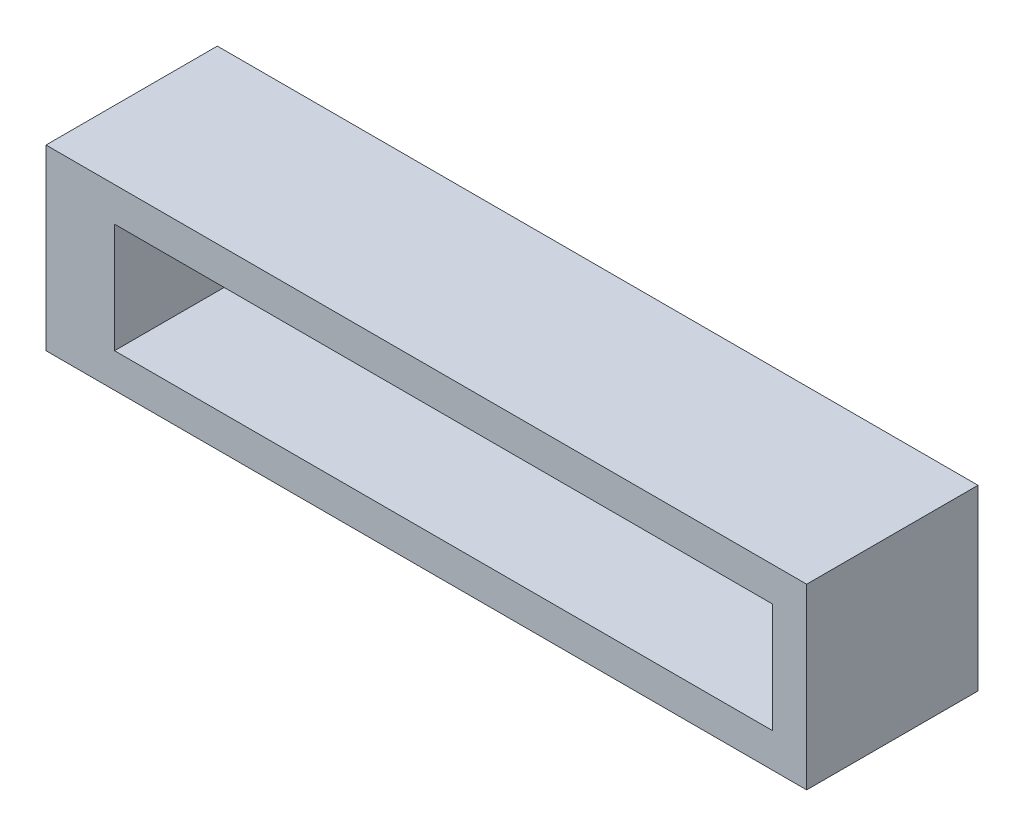
ISO-10303-21;
HEADER;
FILE_DESCRIPTION(('STEP AP214'),'2;1');
FILE_NAME('part.step','',(''),(''),'','','');
FILE_SCHEMA(('AUTOMOTIVE_DESIGN { 1 0 10303 214 1 1 1 1 }'));
ENDSEC;
DATA;
#1=APPLICATION_CONTEXT('core data for automotive mechanical design processes');
#2=APPLICATION_PROTOCOL_DEFINITION('international standard','automotive_design',2000,#1);
#3=PRODUCT_CONTEXT('',#1,'mechanical');
#4=PRODUCT('Part','Part','',(#3));
#5=PRODUCT_RELATED_PRODUCT_CATEGORY('part','',(#4));
#6=PRODUCT_DEFINITION_FORMATION('','',#4);
#7=PRODUCT_DEFINITION_CONTEXT('part definition',#1,'design');
#8=PRODUCT_DEFINITION('design','',#6,#7);
#9=PRODUCT_DEFINITION_SHAPE('','',#8);
#10=(LENGTH_UNIT() NAMED_UNIT(*) SI_UNIT(.MILLI.,.METRE.));
#11=(NAMED_UNIT(*) PLANE_ANGLE_UNIT() SI_UNIT($,.RADIAN.));
#12=(NAMED_UNIT(*) SI_UNIT($,.STERADIAN.) SOLID_ANGLE_UNIT());
#13=UNCERTAINTY_MEASURE_WITH_UNIT(LENGTH_MEASURE(1.E-05),#10,'distance_accuracy_value','');
#14=(GEOMETRIC_REPRESENTATION_CONTEXT(3) GLOBAL_UNCERTAINTY_ASSIGNED_CONTEXT((#13)) GLOBAL_UNIT_ASSIGNED_CONTEXT((#10,
#11,#12)) REPRESENTATION_CONTEXT('',''));
#15=CARTESIAN_POINT('',(0.,0.,0.));
#16=DIRECTION('',(0.,0.,1.));
#17=DIRECTION('',(1.,0.,0.));
#18=AXIS2_PLACEMENT_3D('',#15,#16,#17);
#19=CARTESIAN_POINT('',(0.,0.,5.));
#20=DIRECTION('',(0.,0.,-1.));
#21=DIRECTION('',(-1.,0.,0.));
#22=AXIS2_PLACEMENT_3D('',#19,#20,#21);
#23=PLANE('',#22);
#24=DIRECTION('',(0.,-1.,0.));
#25=VECTOR('',#24,1.);
#26=CARTESIAN_POINT('',(0.,0.,5.));
#27=LINE('',#26,#25);
#28=CARTESIAN_POINT('',(0.,5.2,5.));
#29=VERTEX_POINT('',#28);
#30=CARTESIAN_POINT('',(0.,0.,5.));
#31=VERTEX_POINT('',#30);
#32=EDGE_CURVE('E134',#29,#31,#27,.T.);
#33=ORIENTED_EDGE('',*,*,#32,.T.);
#34=DIRECTION('',(1.,0.,0.));
#35=VECTOR('',#34,1.);
#36=CARTESIAN_POINT('',(0.,0.,5.));
#37=LINE('',#36,#35);
#38=CARTESIAN_POINT('',(22.2,0.,5.));
#39=VERTEX_POINT('',#38);
#40=EDGE_CURVE('E137',#31,#39,#37,.T.);
#41=ORIENTED_EDGE('',*,*,#40,.T.);
#42=DIRECTION('',(0.,1.,0.));
#43=VECTOR('',#42,1.);
#44=CARTESIAN_POINT('',(22.2,0.,5.));
#45=LINE('',#44,#43);
#46=CARTESIAN_POINT('',(22.2,5.2,5.));
#47=VERTEX_POINT('',#46);
#48=EDGE_CURVE('E140',#39,#47,#45,.T.);
#49=ORIENTED_EDGE('',*,*,#48,.T.);
#50=DIRECTION('',(-1.,0.,0.));
#51=VECTOR('',#50,1.);
#52=CARTESIAN_POINT('',(0.,5.2,5.));
#53=LINE('',#52,#51);
#54=EDGE_CURVE('E142',#47,#29,#53,.T.);
#55=ORIENTED_EDGE('',*,*,#54,.T.);
#56=EDGE_LOOP('',(#33,#41,#49,#55));
#57=FACE_BOUND('',#56,.T.);
#58=DIRECTION('',(0.,-1.,0.));
#59=VECTOR('',#58,1.);
#60=CARTESIAN_POINT('',(2.,1.,5.));
#61=LINE('',#60,#59);
#62=CARTESIAN_POINT('',(2.,4.2,5.));
#63=VERTEX_POINT('',#62);
#64=CARTESIAN_POINT('',(2.,1.,5.));
#65=VERTEX_POINT('',#64);
#66=EDGE_CURVE('E98',#63,#65,#61,.T.);
#67=ORIENTED_EDGE('',*,*,#66,.F.);
#68=DIRECTION('',(-1.,0.,0.));
#69=VECTOR('',#68,1.);
#70=CARTESIAN_POINT('',(2.,4.2,5.));
#71=LINE('',#70,#69);
#72=CARTESIAN_POINT('',(21.2,4.2,5.));
#73=VERTEX_POINT('',#72);
#74=EDGE_CURVE('E120',#73,#63,#71,.T.);
#75=ORIENTED_EDGE('',*,*,#74,.F.);
#76=DIRECTION('',(0.,1.,0.));
#77=VECTOR('',#76,1.);
#78=CARTESIAN_POINT('',(21.2,1.,5.));
#79=LINE('',#78,#77);
#80=CARTESIAN_POINT('',(21.2,1.,5.));
#81=VERTEX_POINT('',#80);
#82=EDGE_CURVE('E118',#81,#73,#79,.T.);
#83=ORIENTED_EDGE('',*,*,#82,.F.);
#84=DIRECTION('',(1.,0.,0.));
#85=VECTOR('',#84,1.);
#86=CARTESIAN_POINT('',(2.,1.,5.));
#87=LINE('',#86,#85);
#88=EDGE_CURVE('E106',#65,#81,#87,.T.);
#89=ORIENTED_EDGE('',*,*,#88,.F.);
#90=EDGE_LOOP('',(#67,#75,#83,#89));
#91=FACE_BOUND('',#90,.T.);
#92=ADVANCED_FACE('F33',(#57,#91),#23,.F.);
#93=CARTESIAN_POINT('',(0.,0.,0.));
#94=DIRECTION('',(0.,0.,-1.));
#95=DIRECTION('',(-1.,0.,0.));
#96=AXIS2_PLACEMENT_3D('',#93,#94,#95);
#97=PLANE('',#96);
#98=DIRECTION('',(0.,-1.,0.));
#99=VECTOR('',#98,1.);
#100=CARTESIAN_POINT('',(0.,0.,0.));
#101=LINE('',#100,#99);
#102=CARTESIAN_POINT('',(0.,5.2,0.));
#103=VERTEX_POINT('',#102);
#104=CARTESIAN_POINT('',(0.,0.,0.));
#105=VERTEX_POINT('',#104);
#106=EDGE_CURVE('E114',#103,#105,#101,.T.);
#107=ORIENTED_EDGE('',*,*,#106,.F.);
#108=DIRECTION('',(-1.,0.,0.));
#109=VECTOR('',#108,1.);
#110=CARTESIAN_POINT('',(0.,5.2,0.));
#111=LINE('',#110,#109);
#112=CARTESIAN_POINT('',(22.2,5.2,0.));
#113=VERTEX_POINT('',#112);
#114=EDGE_CURVE('E138',#113,#103,#111,.T.);
#115=ORIENTED_EDGE('',*,*,#114,.F.);
#116=DIRECTION('',(0.,1.,0.));
#117=VECTOR('',#116,1.);
#118=CARTESIAN_POINT('',(22.2,0.,0.));
#119=LINE('',#118,#117);
#120=CARTESIAN_POINT('',(22.2,0.,0.));
#121=VERTEX_POINT('',#120);
#122=EDGE_CURVE('E149',#121,#113,#119,.T.);
#123=ORIENTED_EDGE('',*,*,#122,.F.);
#124=DIRECTION('',(1.,0.,0.));
#125=VECTOR('',#124,1.);
#126=CARTESIAN_POINT('',(0.,0.,0.));
#127=LINE('',#126,#125);
#128=EDGE_CURVE('E147',#105,#121,#127,.T.);
#129=ORIENTED_EDGE('',*,*,#128,.F.);
#130=EDGE_LOOP('',(#107,#115,#123,#129));
#131=FACE_BOUND('',#130,.T.);
#132=DIRECTION('',(-1.,0.,0.));
#133=VECTOR('',#132,1.);
#134=CARTESIAN_POINT('',(2.,4.2,0.));
#135=LINE('',#134,#133);
#136=CARTESIAN_POINT('',(21.2,4.2,0.));
#137=VERTEX_POINT('',#136);
#138=CARTESIAN_POINT('',(2.,4.2,0.));
#139=VERTEX_POINT('',#138);
#140=EDGE_CURVE('E107',#137,#139,#135,.T.);
#141=ORIENTED_EDGE('',*,*,#140,.T.);
#142=DIRECTION('',(0.,-1.,0.));
#143=VECTOR('',#142,1.);
#144=CARTESIAN_POINT('',(2.,1.,0.));
#145=LINE('',#144,#143);
#146=CARTESIAN_POINT('',(2.,1.,0.));
#147=VERTEX_POINT('',#146);
#148=EDGE_CURVE('E56',#139,#147,#145,.T.);
#149=ORIENTED_EDGE('',*,*,#148,.T.);
#150=DIRECTION('',(1.,0.,0.));
#151=VECTOR('',#150,1.);
#152=CARTESIAN_POINT('',(2.,1.,0.));
#153=LINE('',#152,#151);
#154=CARTESIAN_POINT('',(21.2,1.,0.));
#155=VERTEX_POINT('',#154);
#156=EDGE_CURVE('E113',#147,#155,#153,.T.);
#157=ORIENTED_EDGE('',*,*,#156,.T.);
#158=DIRECTION('',(0.,1.,0.));
#159=VECTOR('',#158,1.);
#160=CARTESIAN_POINT('',(21.2,1.,0.));
#161=LINE('',#160,#159);
#162=EDGE_CURVE('E126',#155,#137,#161,.T.);
#163=ORIENTED_EDGE('',*,*,#162,.T.);
#164=EDGE_LOOP('',(#141,#149,#157,#163));
#165=FACE_BOUND('',#164,.T.);
#166=ADVANCED_FACE('F167',(#131,#165),#97,.T.);
#167=CARTESIAN_POINT('',(0.,0.,5.));
#168=DIRECTION('',(1.,0.,0.));
#169=DIRECTION('',(0.,0.,-1.));
#170=AXIS2_PLACEMENT_3D('',#167,#168,#169);
#171=PLANE('',#170);
#172=ORIENTED_EDGE('',*,*,#106,.T.);
#173=DIRECTION('',(0.,0.,-1.));
#174=VECTOR('',#173,1.);
#175=CARTESIAN_POINT('',(0.,0.,5.));
#176=LINE('',#175,#174);
#177=EDGE_CURVE('E11',#31,#105,#176,.T.);
#178=ORIENTED_EDGE('',*,*,#177,.F.);
#179=ORIENTED_EDGE('',*,*,#32,.F.);
#180=DIRECTION('',(0.,0.,-1.));
#181=VECTOR('',#180,1.);
#182=CARTESIAN_POINT('',(0.,5.2,5.));
#183=LINE('',#182,#181);
#184=EDGE_CURVE('E144',#29,#103,#183,.T.);
#185=ORIENTED_EDGE('',*,*,#184,.T.);
#186=EDGE_LOOP('',(#172,#178,#179,#185));
#187=FACE_BOUND('',#186,.T.);
#188=ADVANCED_FACE('F35',(#187),#171,.F.);
#189=CARTESIAN_POINT('',(0.,0.,5.));
#190=DIRECTION('',(0.,1.,0.));
#191=DIRECTION('',(0.,0.,1.));
#192=AXIS2_PLACEMENT_3D('',#189,#190,#191);
#193=PLANE('',#192);
#194=ORIENTED_EDGE('',*,*,#128,.T.);
#195=DIRECTION('',(0.,0.,-1.));
#196=VECTOR('',#195,1.);
#197=CARTESIAN_POINT('',(22.2,0.,5.));
#198=LINE('',#197,#196);
#199=EDGE_CURVE('E41',#39,#121,#198,.T.);
#200=ORIENTED_EDGE('',*,*,#199,.F.);
#201=ORIENTED_EDGE('',*,*,#40,.F.);
#202=ORIENTED_EDGE('',*,*,#177,.T.);
#203=EDGE_LOOP('',(#194,#200,#201,#202));
#204=FACE_BOUND('',#203,.T.);
#205=ADVANCED_FACE('F177',(#204),#193,.F.);
#206=CARTESIAN_POINT('',(22.2,0.,5.));
#207=DIRECTION('',(-1.,0.,0.));
#208=DIRECTION('',(0.,0.,1.));
#209=AXIS2_PLACEMENT_3D('',#206,#207,#208);
#210=PLANE('',#209);
#211=ORIENTED_EDGE('',*,*,#122,.T.);
#212=DIRECTION('',(0.,0.,-1.));
#213=VECTOR('',#212,1.);
#214=CARTESIAN_POINT('',(22.2,5.2,5.));
#215=LINE('',#214,#213);
#216=EDGE_CURVE('E154',#47,#113,#215,.T.);
#217=ORIENTED_EDGE('',*,*,#216,.F.);
#218=ORIENTED_EDGE('',*,*,#48,.F.);
#219=ORIENTED_EDGE('',*,*,#199,.T.);
#220=EDGE_LOOP('',(#211,#217,#218,#219));
#221=FACE_BOUND('',#220,.T.);
#222=ADVANCED_FACE('F161',(#221),#210,.F.);
#223=CARTESIAN_POINT('',(0.,5.2,5.));
#224=DIRECTION('',(0.,-1.,0.));
#225=DIRECTION('',(0.,0.,-1.));
#226=AXIS2_PLACEMENT_3D('',#223,#224,#225);
#227=PLANE('',#226);
#228=ORIENTED_EDGE('',*,*,#114,.T.);
#229=ORIENTED_EDGE('',*,*,#184,.F.);
#230=ORIENTED_EDGE('',*,*,#54,.F.);
#231=ORIENTED_EDGE('',*,*,#216,.T.);
#232=EDGE_LOOP('',(#228,#229,#230,#231));
#233=FACE_BOUND('',#232,.T.);
#234=ADVANCED_FACE('F171',(#233),#227,.F.);
#235=CARTESIAN_POINT('',(2.,1.,5.));
#236=DIRECTION('',(1.,0.,0.));
#237=DIRECTION('',(0.,0.,-1.));
#238=AXIS2_PLACEMENT_3D('',#235,#236,#237);
#239=PLANE('',#238);
#240=ORIENTED_EDGE('',*,*,#148,.F.);
#241=DIRECTION('',(0.,0.,-1.));
#242=VECTOR('',#241,1.);
#243=CARTESIAN_POINT('',(2.,4.2,5.));
#244=LINE('',#243,#242);
#245=EDGE_CURVE('E102',#63,#139,#244,.T.);
#246=ORIENTED_EDGE('',*,*,#245,.F.);
#247=ORIENTED_EDGE('',*,*,#66,.T.);
#248=DIRECTION('',(0.,0.,-1.));
#249=VECTOR('',#248,1.);
#250=CARTESIAN_POINT('',(2.,1.,5.));
#251=LINE('',#250,#249);
#252=EDGE_CURVE('E101',#65,#147,#251,.T.);
#253=ORIENTED_EDGE('',*,*,#252,.T.);
#254=EDGE_LOOP('',(#240,#246,#247,#253));
#255=FACE_BOUND('',#254,.T.);
#256=ADVANCED_FACE('F100',(#255),#239,.T.);
#257=CARTESIAN_POINT('',(2.,1.,5.));
#258=DIRECTION('',(0.,1.,0.));
#259=DIRECTION('',(0.,0.,1.));
#260=AXIS2_PLACEMENT_3D('',#257,#258,#259);
#261=PLANE('',#260);
#262=ORIENTED_EDGE('',*,*,#156,.F.);
#263=ORIENTED_EDGE('',*,*,#252,.F.);
#264=ORIENTED_EDGE('',*,*,#88,.T.);
#265=DIRECTION('',(0.,0.,-1.));
#266=VECTOR('',#265,1.);
#267=CARTESIAN_POINT('',(21.2,1.,5.));
#268=LINE('',#267,#266);
#269=EDGE_CURVE('E115',#81,#155,#268,.T.);
#270=ORIENTED_EDGE('',*,*,#269,.T.);
#271=EDGE_LOOP('',(#262,#263,#264,#270));
#272=FACE_BOUND('',#271,.T.);
#273=ADVANCED_FACE('F110',(#272),#261,.T.);
#274=CARTESIAN_POINT('',(21.2,1.,5.));
#275=DIRECTION('',(-1.,0.,0.));
#276=DIRECTION('',(0.,0.,1.));
#277=AXIS2_PLACEMENT_3D('',#274,#275,#276);
#278=PLANE('',#277);
#279=ORIENTED_EDGE('',*,*,#162,.F.);
#280=ORIENTED_EDGE('',*,*,#269,.F.);
#281=ORIENTED_EDGE('',*,*,#82,.T.);
#282=DIRECTION('',(0.,0.,-1.));
#283=VECTOR('',#282,1.);
#284=CARTESIAN_POINT('',(21.2,4.2,5.));
#285=LINE('',#284,#283);
#286=EDGE_CURVE('E48',#73,#137,#285,.T.);
#287=ORIENTED_EDGE('',*,*,#286,.T.);
#288=EDGE_LOOP('',(#279,#280,#281,#287));
#289=FACE_BOUND('',#288,.T.);
#290=ADVANCED_FACE('F200',(#289),#278,.T.);
#291=CARTESIAN_POINT('',(2.,4.2,5.));
#292=DIRECTION('',(0.,-1.,0.));
#293=DIRECTION('',(0.,0.,-1.));
#294=AXIS2_PLACEMENT_3D('',#291,#292,#293);
#295=PLANE('',#294);
#296=ORIENTED_EDGE('',*,*,#140,.F.);
#297=ORIENTED_EDGE('',*,*,#286,.F.);
#298=ORIENTED_EDGE('',*,*,#74,.T.);
#299=ORIENTED_EDGE('',*,*,#245,.T.);
#300=EDGE_LOOP('',(#296,#297,#298,#299));
#301=FACE_BOUND('',#300,.T.);
#302=ADVANCED_FACE('F204',(#301),#295,.T.);
#303=CLOSED_SHELL('',(#92,#166,#188,#205,#222,#234,#256,#273,#290,#302));
#304=MANIFOLD_SOLID_BREP('B2',#303);
#305=ADVANCED_BREP_SHAPE_REPRESENTATION('',(#18,#304),#14);
#306=SHAPE_DEFINITION_REPRESENTATION(#9,#305);
ENDSEC;
END-ISO-10303-21;
